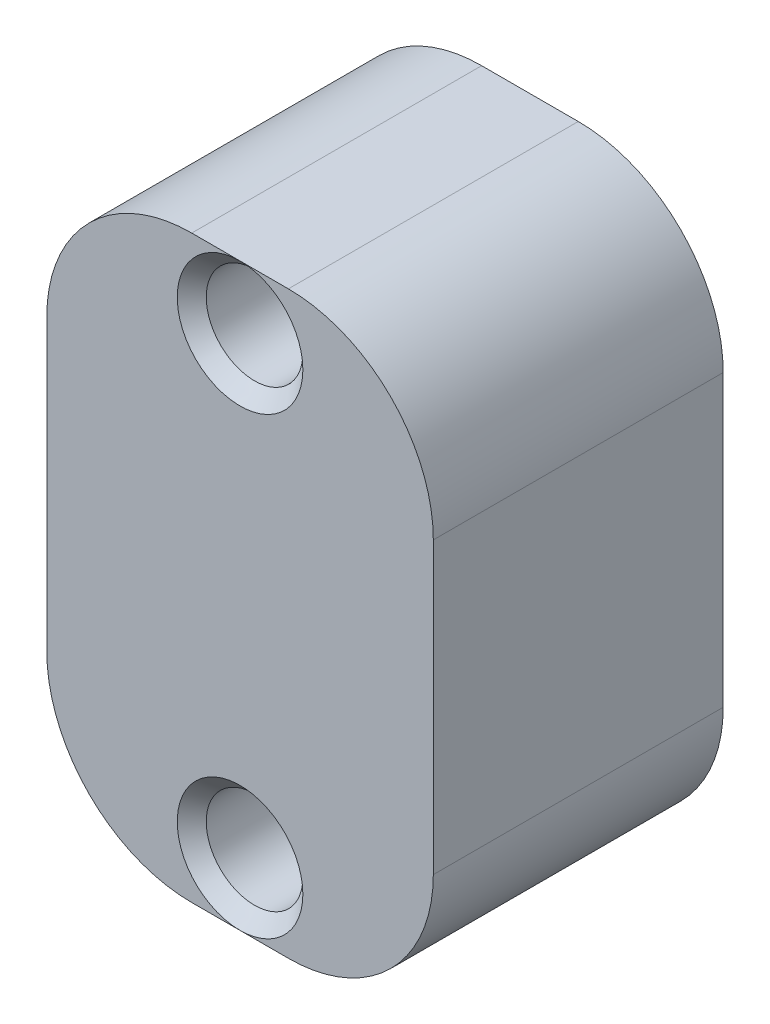
ISO-10303-21;
HEADER;
FILE_DESCRIPTION(('STEP AP214'),'2;1');
FILE_NAME('part.step','',(''),(''),'','','');
FILE_SCHEMA(('AUTOMOTIVE_DESIGN { 1 0 10303 214 1 1 1 1 }'));
ENDSEC;
DATA;
#1=APPLICATION_CONTEXT('core data for automotive mechanical design processes');
#2=APPLICATION_PROTOCOL_DEFINITION('international standard','automotive_design',2000,#1);
#3=PRODUCT_CONTEXT('',#1,'mechanical');
#4=PRODUCT('Part','Part','',(#3));
#5=PRODUCT_RELATED_PRODUCT_CATEGORY('part','',(#4));
#6=PRODUCT_DEFINITION_FORMATION('','',#4);
#7=PRODUCT_DEFINITION_CONTEXT('part definition',#1,'design');
#8=PRODUCT_DEFINITION('design','',#6,#7);
#9=PRODUCT_DEFINITION_SHAPE('','',#8);
#10=(LENGTH_UNIT() NAMED_UNIT(*) SI_UNIT(.MILLI.,.METRE.));
#11=(NAMED_UNIT(*) PLANE_ANGLE_UNIT() SI_UNIT($,.RADIAN.));
#12=(NAMED_UNIT(*) SI_UNIT($,.STERADIAN.) SOLID_ANGLE_UNIT());
#13=UNCERTAINTY_MEASURE_WITH_UNIT(LENGTH_MEASURE(1.E-05),#10,'distance_accuracy_value','');
#14=(GEOMETRIC_REPRESENTATION_CONTEXT(3) GLOBAL_UNCERTAINTY_ASSIGNED_CONTEXT((#13)) GLOBAL_UNIT_ASSIGNED_CONTEXT((#10,
#11,#12)) REPRESENTATION_CONTEXT('',''));
#15=CARTESIAN_POINT('',(0.,0.,0.));
#16=DIRECTION('',(0.,0.,1.));
#17=DIRECTION('',(1.,0.,0.));
#18=AXIS2_PLACEMENT_3D('',#15,#16,#17);
#19=CARTESIAN_POINT('',(14.,12.,-15.));
#20=DIRECTION('',(0.,1.,0.));
#21=DIRECTION('',(0.,0.,1.));
#22=AXIS2_PLACEMENT_3D('',#19,#20,#21);
#23=PLANE('',#22);
#24=DIRECTION('',(0.,0.,1.));
#25=VECTOR('',#24,1.);
#26=CARTESIAN_POINT('',(0.,12.,-15.));
#27=LINE('',#26,#25);
#28=CARTESIAN_POINT('',(0.,12.,-14.25));
#29=VERTEX_POINT('',#28);
#30=CARTESIAN_POINT('',(0.,12.,-6.));
#31=VERTEX_POINT('',#30);
#32=EDGE_CURVE('E203',#29,#31,#27,.T.);
#33=ORIENTED_EDGE('',*,*,#32,.T.);
#34=DIRECTION('',(-1.,0.,0.));
#35=VECTOR('',#34,1.);
#36=CARTESIAN_POINT('',(14.,12.,-6.));
#37=LINE('',#36,#35);
#38=CARTESIAN_POINT('',(14.,12.,-6.));
#39=VERTEX_POINT('',#38);
#40=EDGE_CURVE('E315',#31,#39,#37,.F.);
#41=ORIENTED_EDGE('',*,*,#40,.T.);
#42=DIRECTION('',(0.,0.,1.));
#43=VECTOR('',#42,1.);
#44=CARTESIAN_POINT('',(14.,12.,-15.));
#45=LINE('',#44,#43);
#46=CARTESIAN_POINT('',(14.,12.,-14.25));
#47=VERTEX_POINT('',#46);
#48=EDGE_CURVE('E229',#47,#39,#45,.T.);
#49=ORIENTED_EDGE('',*,*,#48,.F.);
#50=DIRECTION('',(-1.,0.,0.));
#51=VECTOR('',#50,1.);
#52=CARTESIAN_POINT('',(0.,12.,-14.25));
#53=LINE('',#52,#51);
#54=EDGE_CURVE('E264',#47,#29,#53,.T.);
#55=ORIENTED_EDGE('',*,*,#54,.T.);
#56=EDGE_LOOP('',(#33,#41,#49,#55));
#57=FACE_BOUND('',#56,.T.);
#58=ADVANCED_FACE('F52',(#57),#23,.T.);
#59=CARTESIAN_POINT('',(14.,15.,-15.));
#60=DIRECTION('',(0.,0.,1.));
#61=DIRECTION('',(1.,0.,0.));
#62=AXIS2_PLACEMENT_3D('',#59,#60,#61);
#63=CYLINDRICAL_SURFACE('',#62,3.00000000000001);
#64=ORIENTED_EDGE('',*,*,#48,.T.);
#65=CARTESIAN_POINT('',(14.,15.,-6.));
#66=DIRECTION('',(0.,0.,-1.));
#67=DIRECTION('',(-1.,0.,0.));
#68=AXIS2_PLACEMENT_3D('',#65,#66,#67);
#69=CIRCLE('',#68,3.00000000000001);
#70=CARTESIAN_POINT('',(14.,18.,-6.));
#71=VERTEX_POINT('',#70);
#72=EDGE_CURVE('E77',#39,#71,#69,.F.);
#73=ORIENTED_EDGE('',*,*,#72,.T.);
#74=DIRECTION('',(0.,0.,1.));
#75=VECTOR('',#74,1.);
#76=CARTESIAN_POINT('',(14.,18.,-15.));
#77=LINE('',#76,#75);
#78=CARTESIAN_POINT('',(14.,18.,-14.25));
#79=VERTEX_POINT('',#78);
#80=EDGE_CURVE('E231',#79,#71,#77,.T.);
#81=ORIENTED_EDGE('',*,*,#80,.F.);
#82=CARTESIAN_POINT('',(14.,15.,-14.25));
#83=DIRECTION('',(0.,0.,1.));
#84=DIRECTION('',(1.,0.,0.));
#85=AXIS2_PLACEMENT_3D('',#82,#83,#84);
#86=CIRCLE('',#85,3.00000000000001);
#87=EDGE_CURVE('E281',#79,#47,#86,.F.);
#88=ORIENTED_EDGE('',*,*,#87,.T.);
#89=EDGE_LOOP('',(#64,#73,#81,#88));
#90=FACE_BOUND('',#89,.T.);
#91=ADVANCED_FACE('F366',(#90),#63,.F.);
#92=CARTESIAN_POINT('',(14.,18.,-15.));
#93=DIRECTION('',(0.,-1.,0.));
#94=DIRECTION('',(0.,0.,-1.));
#95=AXIS2_PLACEMENT_3D('',#92,#93,#94);
#96=PLANE('',#95);
#97=ORIENTED_EDGE('',*,*,#80,.T.);
#98=DIRECTION('',(1.,0.,0.));
#99=VECTOR('',#98,1.);
#100=CARTESIAN_POINT('',(0.,18.,-6.));
#101=LINE('',#100,#99);
#102=CARTESIAN_POINT('',(0.,18.,-6.));
#103=VERTEX_POINT('',#102);
#104=EDGE_CURVE('E69',#71,#103,#101,.F.);
#105=ORIENTED_EDGE('',*,*,#104,.T.);
#106=DIRECTION('',(0.,0.,1.));
#107=VECTOR('',#106,1.);
#108=CARTESIAN_POINT('',(0.,18.,-15.));
#109=LINE('',#108,#107);
#110=CARTESIAN_POINT('',(0.,18.,-14.25));
#111=VERTEX_POINT('',#110);
#112=EDGE_CURVE('E233',#111,#103,#109,.T.);
#113=ORIENTED_EDGE('',*,*,#112,.F.);
#114=DIRECTION('',(1.,0.,0.));
#115=VECTOR('',#114,1.);
#116=CARTESIAN_POINT('',(14.,18.,-14.25));
#117=LINE('',#116,#115);
#118=EDGE_CURVE('E283',#111,#79,#117,.T.);
#119=ORIENTED_EDGE('',*,*,#118,.T.);
#120=EDGE_LOOP('',(#97,#105,#113,#119));
#121=FACE_BOUND('',#120,.T.);
#122=ADVANCED_FACE('F365',(#121),#96,.T.);
#123=CARTESIAN_POINT('',(0.,30.,-15.));
#124=DIRECTION('',(-1.,0.,0.));
#125=DIRECTION('',(0.,-1.,0.));
#126=AXIS2_PLACEMENT_3D('',#123,#124,#125);
#127=PLANE('',#126);
#128=DIRECTION('',(0.,-1.,0.));
#129=VECTOR('',#128,1.);
#130=CARTESIAN_POINT('',(0.,30.,-15.));
#131=LINE('',#130,#129);
#132=CARTESIAN_POINT('',(0.,22.5,-15.));
#133=VERTEX_POINT('',#132);
#134=CARTESIAN_POINT('',(0.,18.75,-15.));
#135=VERTEX_POINT('',#134);
#136=EDGE_CURVE('E217',#133,#135,#131,.T.);
#137=ORIENTED_EDGE('',*,*,#136,.T.);
#138=DIRECTION('',(0.,-0.707106781186551,0.707106781186544));
#139=VECTOR('',#138,1.);
#140=CARTESIAN_POINT('',(0.,24.3750000000001,-20.625));
#141=LINE('',#140,#139);
#142=EDGE_CURVE('E285',#135,#111,#141,.T.);
#143=ORIENTED_EDGE('',*,*,#142,.T.);
#144=ORIENTED_EDGE('',*,*,#112,.T.);
#145=CARTESIAN_POINT('',(0.,17.,-6.));
#146=DIRECTION('',(-1.,0.,0.));
#147=DIRECTION('',(0.,-1.,0.));
#148=AXIS2_PLACEMENT_3D('',#145,#146,#147);
#149=CIRCLE('',#148,1.);
#150=CARTESIAN_POINT('',(0.,17.,-5.));
#151=VERTEX_POINT('',#150);
#152=EDGE_CURVE('E14',#103,#151,#149,.F.);
#153=ORIENTED_EDGE('',*,*,#152,.T.);
#154=DIRECTION('',(0.,1.,0.));
#155=VECTOR('',#154,1.);
#156=CARTESIAN_POINT('',(0.,18.,-5.));
#157=LINE('',#156,#155);
#158=CARTESIAN_POINT('',(0.,13.,-5.));
#159=VERTEX_POINT('',#158);
#160=EDGE_CURVE('E307',#159,#151,#157,.T.);
#161=ORIENTED_EDGE('',*,*,#160,.F.);
#162=CARTESIAN_POINT('',(0.,13.,-6.));
#163=DIRECTION('',(-1.,0.,0.));
#164=DIRECTION('',(0.,-1.,0.));
#165=AXIS2_PLACEMENT_3D('',#162,#163,#164);
#166=CIRCLE('',#165,1.);
#167=EDGE_CURVE('E61',#159,#31,#166,.F.);
#168=ORIENTED_EDGE('',*,*,#167,.T.);
#169=ORIENTED_EDGE('',*,*,#32,.F.);
#170=DIRECTION('',(0.,-0.707106781186551,-0.707106781186544));
#171=VECTOR('',#170,1.);
#172=CARTESIAN_POINT('',(0.,11.625,-14.625));
#173=LINE('',#172,#171);
#174=CARTESIAN_POINT('',(0.,11.25,-15.));
#175=VERTEX_POINT('',#174);
#176=EDGE_CURVE('E267',#29,#175,#173,.T.);
#177=ORIENTED_EDGE('',*,*,#176,.T.);
#178=DIRECTION('',(0.,-1.,0.));
#179=VECTOR('',#178,1.);
#180=CARTESIAN_POINT('',(0.,12.,-15.));
#181=LINE('',#180,#179);
#182=CARTESIAN_POINT('',(0.,7.5,-15.));
#183=VERTEX_POINT('',#182);
#184=EDGE_CURVE('E200',#175,#183,#181,.T.);
#185=ORIENTED_EDGE('',*,*,#184,.T.);
#186=DIRECTION('',(0.,0.,1.));
#187=VECTOR('',#186,1.);
#188=CARTESIAN_POINT('',(0.,7.5,-15.));
#189=LINE('',#188,#187);
#190=CARTESIAN_POINT('',(0.,7.5,0.));
#191=VERTEX_POINT('',#190);
#192=EDGE_CURVE('E185',#183,#191,#189,.T.);
#193=ORIENTED_EDGE('',*,*,#192,.T.);
#194=DIRECTION('',(0.,-1.,0.));
#195=VECTOR('',#194,1.);
#196=CARTESIAN_POINT('',(0.,12.,0.));
#197=LINE('',#196,#195);
#198=CARTESIAN_POINT('',(0.,22.5,0.));
#199=VERTEX_POINT('',#198);
#200=EDGE_CURVE('E197',#199,#191,#197,.T.);
#201=ORIENTED_EDGE('',*,*,#200,.F.);
#202=DIRECTION('',(0.,0.,1.));
#203=VECTOR('',#202,1.);
#204=CARTESIAN_POINT('',(0.,22.5,-15.));
#205=LINE('',#204,#203);
#206=EDGE_CURVE('E262',#199,#133,#205,.F.);
#207=ORIENTED_EDGE('',*,*,#206,.T.);
#208=EDGE_LOOP('',(#137,#143,#144,#153,#161,#168,#169,#177,#185,#193,#201,#207));
#209=FACE_BOUND('',#208,.T.);
#210=ADVANCED_FACE('F196',(#209),#127,.T.);
#211=CARTESIAN_POINT('',(0.,30.,-15.));
#212=DIRECTION('',(0.,1.,0.));
#213=DIRECTION('',(-1.,0.,0.));
#214=AXIS2_PLACEMENT_3D('',#211,#212,#213);
#215=PLANE('',#214);
#216=DIRECTION('',(-1.,0.,0.));
#217=VECTOR('',#216,1.);
#218=CARTESIAN_POINT('',(0.,30.,0.));
#219=LINE('',#218,#217);
#220=CARTESIAN_POINT('',(12.5,30.,0.));
#221=VERTEX_POINT('',#220);
#222=CARTESIAN_POINT('',(10.,30.,0.));
#223=VERTEX_POINT('',#222);
#224=EDGE_CURVE('E224',#221,#223,#219,.T.);
#225=ORIENTED_EDGE('',*,*,#224,.F.);
#226=DIRECTION('',(0.,0.,1.));
#227=VECTOR('',#226,1.);
#228=CARTESIAN_POINT('',(12.5,30.,-15.));
#229=LINE('',#228,#227);
#230=CARTESIAN_POINT('',(12.5,30.,-15.));
#231=VERTEX_POINT('',#230);
#232=EDGE_CURVE('E260',#221,#231,#229,.F.);
#233=ORIENTED_EDGE('',*,*,#232,.T.);
#234=DIRECTION('',(-1.,0.,0.));
#235=VECTOR('',#234,1.);
#236=CARTESIAN_POINT('',(0.,30.,-15.));
#237=LINE('',#236,#235);
#238=CARTESIAN_POINT('',(10.,30.,-15.));
#239=VERTEX_POINT('',#238);
#240=EDGE_CURVE('E343',#231,#239,#237,.T.);
#241=ORIENTED_EDGE('',*,*,#240,.T.);
#242=CARTESIAN_POINT('',(7.49999999999999,30.,-15.));
#243=VERTEX_POINT('',#242);
#244=EDGE_CURVE('E342',#239,#243,#237,.T.);
#245=ORIENTED_EDGE('',*,*,#244,.T.);
#246=DIRECTION('',(0.,0.,1.));
#247=VECTOR('',#246,1.);
#248=CARTESIAN_POINT('',(7.49999999999999,30.,-15.));
#249=LINE('',#248,#247);
#250=CARTESIAN_POINT('',(7.49999999999999,30.,0.));
#251=VERTEX_POINT('',#250);
#252=EDGE_CURVE('E257',#243,#251,#249,.T.);
#253=ORIENTED_EDGE('',*,*,#252,.T.);
#254=EDGE_CURVE('E223',#223,#251,#219,.T.);
#255=ORIENTED_EDGE('',*,*,#254,.F.);
#256=EDGE_LOOP('',(#225,#233,#241,#245,#253,#255));
#257=FACE_BOUND('',#256,.T.);
#258=ADVANCED_FACE('F349',(#257),#215,.T.);
#259=CARTESIAN_POINT('',(20.,30.,-15.));
#260=DIRECTION('',(1.,0.,0.));
#261=DIRECTION('',(0.,0.,-1.));
#262=AXIS2_PLACEMENT_3D('',#259,#260,#261);
#263=PLANE('',#262);
#264=DIRECTION('',(0.,1.,0.));
#265=VECTOR('',#264,1.);
#266=CARTESIAN_POINT('',(20.,30.,0.));
#267=LINE('',#266,#265);
#268=CARTESIAN_POINT('',(20.,7.5,0.));
#269=VERTEX_POINT('',#268);
#270=CARTESIAN_POINT('',(20.,22.5,0.));
#271=VERTEX_POINT('',#270);
#272=EDGE_CURVE('E220',#269,#271,#267,.T.);
#273=ORIENTED_EDGE('',*,*,#272,.F.);
#274=DIRECTION('',(0.,0.,1.));
#275=VECTOR('',#274,1.);
#276=CARTESIAN_POINT('',(20.,7.5,-15.));
#277=LINE('',#276,#275);
#278=CARTESIAN_POINT('',(20.,7.5,-15.));
#279=VERTEX_POINT('',#278);
#280=EDGE_CURVE('E255',#269,#279,#277,.F.);
#281=ORIENTED_EDGE('',*,*,#280,.T.);
#282=DIRECTION('',(0.,1.,0.));
#283=VECTOR('',#282,1.);
#284=CARTESIAN_POINT('',(20.,30.,-15.));
#285=LINE('',#284,#283);
#286=CARTESIAN_POINT('',(20.,22.5,-15.));
#287=VERTEX_POINT('',#286);
#288=EDGE_CURVE('E340',#279,#287,#285,.T.);
#289=ORIENTED_EDGE('',*,*,#288,.T.);
#290=DIRECTION('',(0.,0.,1.));
#291=VECTOR('',#290,1.);
#292=CARTESIAN_POINT('',(20.,22.5,-15.));
#293=LINE('',#292,#291);
#294=EDGE_CURVE('E252',#287,#271,#293,.T.);
#295=ORIENTED_EDGE('',*,*,#294,.T.);
#296=EDGE_LOOP('',(#273,#281,#289,#295));
#297=FACE_BOUND('',#296,.T.);
#298=ADVANCED_FACE('F419',(#297),#263,.T.);
#299=CARTESIAN_POINT('',(20.,0.,-15.));
#300=DIRECTION('',(0.,-1.,0.));
#301=DIRECTION('',(1.,0.,0.));
#302=AXIS2_PLACEMENT_3D('',#299,#300,#301);
#303=PLANE('',#302);
#304=DIRECTION('',(1.,0.,0.));
#305=VECTOR('',#304,1.);
#306=CARTESIAN_POINT('',(20.,0.,0.));
#307=LINE('',#306,#305);
#308=CARTESIAN_POINT('',(7.5,0.,0.));
#309=VERTEX_POINT('',#308);
#310=CARTESIAN_POINT('',(10.,0.,0.));
#311=VERTEX_POINT('',#310);
#312=EDGE_CURVE('E211',#309,#311,#307,.T.);
#313=ORIENTED_EDGE('',*,*,#312,.F.);
#314=DIRECTION('',(0.,0.,1.));
#315=VECTOR('',#314,1.);
#316=CARTESIAN_POINT('',(7.5,0.,-15.));
#317=LINE('',#316,#315);
#318=CARTESIAN_POINT('',(7.5,0.,-15.));
#319=VERTEX_POINT('',#318);
#320=EDGE_CURVE('E186',#309,#319,#317,.F.);
#321=ORIENTED_EDGE('',*,*,#320,.T.);
#322=DIRECTION('',(1.,0.,0.));
#323=VECTOR('',#322,1.);
#324=CARTESIAN_POINT('',(20.,0.,-15.));
#325=LINE('',#324,#323);
#326=CARTESIAN_POINT('',(10.,0.,-15.));
#327=VERTEX_POINT('',#326);
#328=EDGE_CURVE('E337',#319,#327,#325,.T.);
#329=ORIENTED_EDGE('',*,*,#328,.T.);
#330=CARTESIAN_POINT('',(12.5,0.,-15.));
#331=VERTEX_POINT('',#330);
#332=EDGE_CURVE('E336',#327,#331,#325,.T.);
#333=ORIENTED_EDGE('',*,*,#332,.T.);
#334=DIRECTION('',(0.,0.,1.));
#335=VECTOR('',#334,1.);
#336=CARTESIAN_POINT('',(12.5,0.,-15.));
#337=LINE('',#336,#335);
#338=CARTESIAN_POINT('',(12.5,0.,0.));
#339=VERTEX_POINT('',#338);
#340=EDGE_CURVE('E191',#331,#339,#337,.T.);
#341=ORIENTED_EDGE('',*,*,#340,.T.);
#342=EDGE_CURVE('E208',#311,#339,#307,.T.);
#343=ORIENTED_EDGE('',*,*,#342,.F.);
#344=EDGE_LOOP('',(#313,#321,#329,#333,#341,#343));
#345=FACE_BOUND('',#344,.T.);
#346=ADVANCED_FACE('F381',(#345),#303,.T.);
#347=CARTESIAN_POINT('',(14.,15.,-15.));
#348=DIRECTION('',(0.,0.,1.));
#349=DIRECTION('',(1.,0.,0.));
#350=AXIS2_PLACEMENT_3D('',#347,#348,#349);
#351=PLANE('',#350);
#352=ORIENTED_EDGE('',*,*,#184,.F.);
#353=DIRECTION('',(1.,0.,0.));
#354=VECTOR('',#353,1.);
#355=CARTESIAN_POINT('',(14.,11.25,-15.));
#356=LINE('',#355,#354);
#357=CARTESIAN_POINT('',(14.,11.25,-15.));
#358=VERTEX_POINT('',#357);
#359=EDGE_CURVE('E279',#175,#358,#356,.T.);
#360=ORIENTED_EDGE('',*,*,#359,.T.);
#361=CARTESIAN_POINT('',(14.,15.,-15.));
#362=DIRECTION('',(0.,0.,1.));
#363=DIRECTION('',(1.,0.,0.));
#364=AXIS2_PLACEMENT_3D('',#361,#362,#363);
#365=CIRCLE('',#364,3.75000000000001);
#366=CARTESIAN_POINT('',(14.,18.75,-15.));
#367=VERTEX_POINT('',#366);
#368=EDGE_CURVE('E277',#358,#367,#365,.T.);
#369=ORIENTED_EDGE('',*,*,#368,.T.);
#370=DIRECTION('',(-1.,0.,0.));
#371=VECTOR('',#370,1.);
#372=CARTESIAN_POINT('',(0.,18.75,-15.));
#373=LINE('',#372,#371);
#374=EDGE_CURVE('E275',#367,#135,#373,.T.);
#375=ORIENTED_EDGE('',*,*,#374,.T.);
#376=ORIENTED_EDGE('',*,*,#136,.F.);
#377=CARTESIAN_POINT('',(7.5,22.5,-15.));
#378=DIRECTION('',(0.,0.,1.));
#379=DIRECTION('',(1.,0.,0.));
#380=AXIS2_PLACEMENT_3D('',#377,#378,#379);
#381=CIRCLE('',#380,7.5);
#382=EDGE_CURVE('E242',#133,#243,#381,.F.);
#383=ORIENTED_EDGE('',*,*,#382,.T.);
#384=ORIENTED_EDGE('',*,*,#244,.F.);
#385=CARTESIAN_POINT('',(10.,26.75,-15.));
#386=DIRECTION('',(0.,0.,1.));
#387=DIRECTION('',(1.,0.,0.));
#388=AXIS2_PLACEMENT_3D('',#385,#386,#387);
#389=CIRCLE('',#388,3.24999999999999);
#390=EDGE_CURVE('E272',#239,#239,#389,.T.);
#391=ORIENTED_EDGE('',*,*,#390,.T.);
#392=ORIENTED_EDGE('',*,*,#240,.F.);
#393=CARTESIAN_POINT('',(12.5,22.5,-15.));
#394=DIRECTION('',(0.,0.,1.));
#395=DIRECTION('',(1.,0.,0.));
#396=AXIS2_PLACEMENT_3D('',#393,#394,#395);
#397=CIRCLE('',#396,7.5);
#398=EDGE_CURVE('E245',#231,#287,#397,.F.);
#399=ORIENTED_EDGE('',*,*,#398,.T.);
#400=ORIENTED_EDGE('',*,*,#288,.F.);
#401=CARTESIAN_POINT('',(12.5,7.5,-15.));
#402=DIRECTION('',(0.,0.,1.));
#403=DIRECTION('',(1.,0.,0.));
#404=AXIS2_PLACEMENT_3D('',#401,#402,#403);
#405=CIRCLE('',#404,7.5);
#406=EDGE_CURVE('E247',#279,#331,#405,.F.);
#407=ORIENTED_EDGE('',*,*,#406,.T.);
#408=ORIENTED_EDGE('',*,*,#332,.F.);
#409=CARTESIAN_POINT('',(10.,3.25,-15.));
#410=DIRECTION('',(0.,0.,1.));
#411=DIRECTION('',(1.,0.,0.));
#412=AXIS2_PLACEMENT_3D('',#409,#410,#411);
#413=CIRCLE('',#412,3.25);
#414=EDGE_CURVE('E269',#327,#327,#413,.T.);
#415=ORIENTED_EDGE('',*,*,#414,.T.);
#416=ORIENTED_EDGE('',*,*,#328,.F.);
#417=CARTESIAN_POINT('',(7.5,7.5,-15.));
#418=DIRECTION('',(0.,0.,1.));
#419=DIRECTION('',(1.,0.,0.));
#420=AXIS2_PLACEMENT_3D('',#417,#418,#419);
#421=CIRCLE('',#420,7.5);
#422=EDGE_CURVE('E250',#319,#183,#421,.F.);
#423=ORIENTED_EDGE('',*,*,#422,.T.);
#424=EDGE_LOOP('',(#352,#360,#369,#375,#376,#383,#384,#391,#392,#399,#400,#407,#408,#415,#416,#423));
#425=FACE_BOUND('',#424,.T.);
#426=ADVANCED_FACE('F355',(#425),#351,.F.);
#427=CARTESIAN_POINT('',(14.,15.,0.));
#428=DIRECTION('',(0.,0.,1.));
#429=DIRECTION('',(1.,0.,0.));
#430=AXIS2_PLACEMENT_3D('',#427,#428,#429);
#431=PLANE('',#430);
#432=ORIENTED_EDGE('',*,*,#312,.T.);
#433=CARTESIAN_POINT('',(10.,3.25,0.));
#434=DIRECTION('',(0.,0.,1.));
#435=DIRECTION('',(1.,0.,0.));
#436=AXIS2_PLACEMENT_3D('',#433,#434,#435);
#437=CIRCLE('',#436,3.25);
#438=EDGE_CURVE('E302',#311,#311,#437,.F.);
#439=ORIENTED_EDGE('',*,*,#438,.T.);
#440=ORIENTED_EDGE('',*,*,#342,.T.);
#441=CARTESIAN_POINT('',(12.5,7.5,0.));
#442=DIRECTION('',(0.,0.,1.));
#443=DIRECTION('',(1.,0.,0.));
#444=AXIS2_PLACEMENT_3D('',#441,#442,#443);
#445=CIRCLE('',#444,7.5);
#446=EDGE_CURVE('E192',#339,#269,#445,.T.);
#447=ORIENTED_EDGE('',*,*,#446,.T.);
#448=ORIENTED_EDGE('',*,*,#272,.T.);
#449=CARTESIAN_POINT('',(12.5,22.5,0.));
#450=DIRECTION('',(0.,0.,1.));
#451=DIRECTION('',(1.,0.,0.));
#452=AXIS2_PLACEMENT_3D('',#449,#450,#451);
#453=CIRCLE('',#452,7.5);
#454=EDGE_CURVE('E236',#271,#221,#453,.T.);
#455=ORIENTED_EDGE('',*,*,#454,.T.);
#456=ORIENTED_EDGE('',*,*,#224,.T.);
#457=CARTESIAN_POINT('',(10.,26.75,0.));
#458=DIRECTION('',(0.,0.,1.));
#459=DIRECTION('',(1.,0.,0.));
#460=AXIS2_PLACEMENT_3D('',#457,#458,#459);
#461=CIRCLE('',#460,3.25);
#462=EDGE_CURVE('E299',#223,#223,#461,.F.);
#463=ORIENTED_EDGE('',*,*,#462,.T.);
#464=ORIENTED_EDGE('',*,*,#254,.T.);
#465=CARTESIAN_POINT('',(7.5,22.5,0.));
#466=DIRECTION('',(0.,0.,1.));
#467=DIRECTION('',(1.,0.,0.));
#468=AXIS2_PLACEMENT_3D('',#465,#466,#467);
#469=CIRCLE('',#468,7.5);
#470=EDGE_CURVE('E202',#251,#199,#469,.T.);
#471=ORIENTED_EDGE('',*,*,#470,.T.);
#472=ORIENTED_EDGE('',*,*,#200,.T.);
#473=CARTESIAN_POINT('',(7.5,7.5,0.));
#474=DIRECTION('',(0.,0.,1.));
#475=DIRECTION('',(1.,0.,0.));
#476=AXIS2_PLACEMENT_3D('',#473,#474,#475);
#477=CIRCLE('',#476,7.5);
#478=EDGE_CURVE('E181',#191,#309,#477,.T.);
#479=ORIENTED_EDGE('',*,*,#478,.T.);
#480=EDGE_LOOP('',(#432,#439,#440,#447,#448,#455,#456,#463,#464,#471,#472,#479));
#481=FACE_BOUND('',#480,.T.);
#482=ADVANCED_FACE('F205',(#481),#431,.T.);
#483=CARTESIAN_POINT('',(10.,3.25,-15.));
#484=DIRECTION('',(0.,0.,1.));
#485=DIRECTION('',(1.,0.,0.));
#486=AXIS2_PLACEMENT_3D('',#483,#484,#485);
#487=CYLINDRICAL_SURFACE('',#486,2.5);
#488=CARTESIAN_POINT('',(10.,3.25,-14.25));
#489=DIRECTION('',(0.,0.,1.));
#490=DIRECTION('',(1.,0.,0.));
#491=AXIS2_PLACEMENT_3D('',#488,#489,#490);
#492=CIRCLE('',#491,2.5);
#493=CARTESIAN_POINT('',(12.5,3.25,-14.25));
#494=VERTEX_POINT('',#493);
#495=EDGE_CURVE('E296',#494,#494,#492,.F.);
#496=ORIENTED_EDGE('',*,*,#495,.T.);
#497=EDGE_LOOP('',(#496));
#498=FACE_BOUND('',#497,.T.);
#499=CARTESIAN_POINT('',(10.,3.25,-0.750000000000001));
#500=DIRECTION('',(0.,0.,1.));
#501=DIRECTION('',(1.,0.,0.));
#502=AXIS2_PLACEMENT_3D('',#499,#500,#501);
#503=CIRCLE('',#502,2.5);
#504=CARTESIAN_POINT('',(12.5,3.25,-0.750000000000001));
#505=VERTEX_POINT('',#504);
#506=EDGE_CURVE('E293',#505,#505,#503,.T.);
#507=ORIENTED_EDGE('',*,*,#506,.T.);
#508=EDGE_LOOP('',(#507));
#509=FACE_BOUND('',#508,.T.);
#510=ADVANCED_FACE('F393',(#498,#509),#487,.F.);
#511=CARTESIAN_POINT('',(10.,26.75,-15.));
#512=DIRECTION('',(0.,0.,1.));
#513=DIRECTION('',(1.,0.,0.));
#514=AXIS2_PLACEMENT_3D('',#511,#512,#513);
#515=CYLINDRICAL_SURFACE('',#514,2.5);
#516=CARTESIAN_POINT('',(10.,26.75,-14.25));
#517=DIRECTION('',(0.,0.,1.));
#518=DIRECTION('',(1.,0.,0.));
#519=AXIS2_PLACEMENT_3D('',#516,#517,#518);
#520=CIRCLE('',#519,2.5);
#521=CARTESIAN_POINT('',(12.5,26.75,-14.25));
#522=VERTEX_POINT('',#521);
#523=EDGE_CURVE('E290',#522,#522,#520,.F.);
#524=ORIENTED_EDGE('',*,*,#523,.T.);
#525=EDGE_LOOP('',(#524));
#526=FACE_BOUND('',#525,.T.);
#527=CARTESIAN_POINT('',(10.,26.75,-0.750000000000001));
#528=DIRECTION('',(0.,0.,1.));
#529=DIRECTION('',(1.,0.,0.));
#530=AXIS2_PLACEMENT_3D('',#527,#528,#529);
#531=CIRCLE('',#530,2.5);
#532=CARTESIAN_POINT('',(12.5,26.75,-0.750000000000001));
#533=VERTEX_POINT('',#532);
#534=EDGE_CURVE('E287',#533,#533,#531,.T.);
#535=ORIENTED_EDGE('',*,*,#534,.T.);
#536=EDGE_LOOP('',(#535));
#537=FACE_BOUND('',#536,.T.);
#538=ADVANCED_FACE('F395',(#526,#537),#515,.F.);
#539=CARTESIAN_POINT('',(7.5,7.5,-15.));
#540=DIRECTION('',(0.,0.,1.));
#541=DIRECTION('',(1.,0.,0.));
#542=AXIS2_PLACEMENT_3D('',#539,#540,#541);
#543=CYLINDRICAL_SURFACE('',#542,7.5);
#544=ORIENTED_EDGE('',*,*,#422,.F.);
#545=ORIENTED_EDGE('',*,*,#320,.F.);
#546=ORIENTED_EDGE('',*,*,#478,.F.);
#547=ORIENTED_EDGE('',*,*,#192,.F.);
#548=EDGE_LOOP('',(#544,#545,#546,#547));
#549=FACE_BOUND('',#548,.T.);
#550=ADVANCED_FACE('F184',(#549),#543,.T.);
#551=CARTESIAN_POINT('',(12.5,7.5,-15.));
#552=DIRECTION('',(0.,0.,1.));
#553=DIRECTION('',(1.,0.,0.));
#554=AXIS2_PLACEMENT_3D('',#551,#552,#553);
#555=CYLINDRICAL_SURFACE('',#554,7.5);
#556=ORIENTED_EDGE('',*,*,#406,.F.);
#557=ORIENTED_EDGE('',*,*,#280,.F.);
#558=ORIENTED_EDGE('',*,*,#446,.F.);
#559=ORIENTED_EDGE('',*,*,#340,.F.);
#560=EDGE_LOOP('',(#556,#557,#558,#559));
#561=FACE_BOUND('',#560,.T.);
#562=ADVANCED_FACE('F427',(#561),#555,.T.);
#563=CARTESIAN_POINT('',(12.5,22.5,-15.));
#564=DIRECTION('',(0.,0.,1.));
#565=DIRECTION('',(1.,0.,0.));
#566=AXIS2_PLACEMENT_3D('',#563,#564,#565);
#567=CYLINDRICAL_SURFACE('',#566,7.5);
#568=ORIENTED_EDGE('',*,*,#398,.F.);
#569=ORIENTED_EDGE('',*,*,#232,.F.);
#570=ORIENTED_EDGE('',*,*,#454,.F.);
#571=ORIENTED_EDGE('',*,*,#294,.F.);
#572=EDGE_LOOP('',(#568,#569,#570,#571));
#573=FACE_BOUND('',#572,.T.);
#574=ADVANCED_FACE('F430',(#573),#567,.T.);
#575=CARTESIAN_POINT('',(7.5,22.5,-15.));
#576=DIRECTION('',(0.,0.,1.));
#577=DIRECTION('',(1.,0.,0.));
#578=AXIS2_PLACEMENT_3D('',#575,#576,#577);
#579=CYLINDRICAL_SURFACE('',#578,7.5);
#580=ORIENTED_EDGE('',*,*,#382,.F.);
#581=ORIENTED_EDGE('',*,*,#206,.F.);
#582=ORIENTED_EDGE('',*,*,#470,.F.);
#583=ORIENTED_EDGE('',*,*,#252,.F.);
#584=EDGE_LOOP('',(#580,#581,#582,#583));
#585=FACE_BOUND('',#584,.T.);
#586=ADVANCED_FACE('F357',(#585),#579,.T.);
#587=CARTESIAN_POINT('',(14.,18.,-14.25));
#588=DIRECTION('',(0.,-0.707106781186544,-0.707106781186551));
#589=DIRECTION('',(-1.,0.,0.));
#590=AXIS2_PLACEMENT_3D('',#587,#588,#589);
#591=PLANE('',#590);
#592=ORIENTED_EDGE('',*,*,#142,.F.);
#593=ORIENTED_EDGE('',*,*,#374,.F.);
#594=DIRECTION('',(0.,0.707106781186551,-0.707106781186544));
#595=VECTOR('',#594,1.);
#596=CARTESIAN_POINT('',(14.,18.,-14.25));
#597=LINE('',#596,#595);
#598=EDGE_CURVE('E209',#79,#367,#597,.T.);
#599=ORIENTED_EDGE('',*,*,#598,.F.);
#600=ORIENTED_EDGE('',*,*,#118,.F.);
#601=EDGE_LOOP('',(#592,#593,#599,#600));
#602=FACE_BOUND('',#601,.T.);
#603=ADVANCED_FACE('F362',(#602),#591,.T.);
#604=CARTESIAN_POINT('',(14.,15.,-14.25));
#605=DIRECTION('',(0.,0.,-1.));
#606=DIRECTION('',(-1.,0.,0.));
#607=AXIS2_PLACEMENT_3D('',#604,#605,#606);
#608=CONICAL_SURFACE('',#607,3.00000000000001,0.785398163397453);
#609=ORIENTED_EDGE('',*,*,#598,.T.);
#610=ORIENTED_EDGE('',*,*,#368,.F.);
#611=DIRECTION('',(0.,-0.707106781186552,-0.707106781186543));
#612=VECTOR('',#611,1.);
#613=CARTESIAN_POINT('',(14.,12.,-14.25));
#614=LINE('',#613,#612);
#615=EDGE_CURVE('E214',#47,#358,#614,.T.);
#616=ORIENTED_EDGE('',*,*,#615,.F.);
#617=ORIENTED_EDGE('',*,*,#87,.F.);
#618=EDGE_LOOP('',(#609,#610,#616,#617));
#619=FACE_BOUND('',#618,.T.);
#620=ADVANCED_FACE('F374',(#619),#608,.F.);
#621=CARTESIAN_POINT('',(14.,12.,-14.25));
#622=DIRECTION('',(0.,0.707106781186544,-0.707106781186551));
#623=DIRECTION('',(1.,0.,0.));
#624=AXIS2_PLACEMENT_3D('',#621,#622,#623);
#625=PLANE('',#624);
#626=ORIENTED_EDGE('',*,*,#615,.T.);
#627=ORIENTED_EDGE('',*,*,#359,.F.);
#628=ORIENTED_EDGE('',*,*,#176,.F.);
#629=ORIENTED_EDGE('',*,*,#54,.F.);
#630=EDGE_LOOP('',(#626,#627,#628,#629));
#631=FACE_BOUND('',#630,.T.);
#632=ADVANCED_FACE('F377',(#631),#625,.T.);
#633=CARTESIAN_POINT('',(10.,26.75,-15.));
#634=DIRECTION('',(0.,0.,-1.));
#635=DIRECTION('',(-1.,0.,0.));
#636=AXIS2_PLACEMENT_3D('',#633,#634,#635);
#637=CONICAL_SURFACE('',#636,3.24999999999999,0.785398163397445);
#638=ORIENTED_EDGE('',*,*,#523,.F.);
#639=EDGE_LOOP('',(#638));
#640=FACE_BOUND('',#639,.T.);
#641=ORIENTED_EDGE('',*,*,#390,.F.);
#642=EDGE_LOOP('',(#641));
#643=FACE_BOUND('',#642,.T.);
#644=ADVANCED_FACE('F439',(#640,#643),#637,.F.);
#645=CARTESIAN_POINT('',(10.,3.25,-15.));
#646=DIRECTION('',(0.,0.,-1.));
#647=DIRECTION('',(-1.,0.,0.));
#648=AXIS2_PLACEMENT_3D('',#645,#646,#647);
#649=CONICAL_SURFACE('',#648,3.25,0.785398163397441);
#650=ORIENTED_EDGE('',*,*,#495,.F.);
#651=EDGE_LOOP('',(#650));
#652=FACE_BOUND('',#651,.T.);
#653=ORIENTED_EDGE('',*,*,#414,.F.);
#654=EDGE_LOOP('',(#653));
#655=FACE_BOUND('',#654,.T.);
#656=ADVANCED_FACE('F389',(#652,#655),#649,.F.);
#657=CARTESIAN_POINT('',(10.,3.25,-0.750000000000001));
#658=DIRECTION('',(0.,0.,1.));
#659=DIRECTION('',(1.,0.,0.));
#660=AXIS2_PLACEMENT_3D('',#657,#658,#659);
#661=CONICAL_SURFACE('',#660,2.5,0.785398163397449);
#662=ORIENTED_EDGE('',*,*,#438,.F.);
#663=EDGE_LOOP('',(#662));
#664=FACE_BOUND('',#663,.T.);
#665=ORIENTED_EDGE('',*,*,#506,.F.);
#666=EDGE_LOOP('',(#665));
#667=FACE_BOUND('',#666,.T.);
#668=ADVANCED_FACE('F385',(#664,#667),#661,.F.);
#669=CARTESIAN_POINT('',(10.,26.75,-0.750000000000001));
#670=DIRECTION('',(0.,0.,1.));
#671=DIRECTION('',(1.,0.,0.));
#672=AXIS2_PLACEMENT_3D('',#669,#670,#671);
#673=CONICAL_SURFACE('',#672,2.5,0.78539816339745);
#674=ORIENTED_EDGE('',*,*,#462,.F.);
#675=EDGE_LOOP('',(#674));
#676=FACE_BOUND('',#675,.T.);
#677=ORIENTED_EDGE('',*,*,#534,.F.);
#678=EDGE_LOOP('',(#677));
#679=FACE_BOUND('',#678,.T.);
#680=ADVANCED_FACE('F388',(#676,#679),#673,.F.);
#681=CARTESIAN_POINT('',(14.,15.,-5.));
#682=DIRECTION('',(0.,0.,-1.));
#683=DIRECTION('',(-1.,0.,0.));
#684=AXIS2_PLACEMENT_3D('',#681,#682,#683);
#685=PLANE('',#684);
#686=CARTESIAN_POINT('',(14.,15.,-5.));
#687=DIRECTION('',(0.,0.,-1.));
#688=DIRECTION('',(-1.,0.,0.));
#689=AXIS2_PLACEMENT_3D('',#686,#687,#688);
#690=CIRCLE('',#689,2.00000000000001);
#691=CARTESIAN_POINT('',(14.,17.,-5.));
#692=VERTEX_POINT('',#691);
#693=CARTESIAN_POINT('',(14.,13.,-5.));
#694=VERTEX_POINT('',#693);
#695=EDGE_CURVE('E310',#692,#694,#690,.T.);
#696=ORIENTED_EDGE('',*,*,#695,.T.);
#697=DIRECTION('',(-1.,0.,0.));
#698=VECTOR('',#697,1.);
#699=CARTESIAN_POINT('',(0.,13.,-5.));
#700=LINE('',#699,#698);
#701=EDGE_CURVE('E312',#694,#159,#700,.T.);
#702=ORIENTED_EDGE('',*,*,#701,.T.);
#703=ORIENTED_EDGE('',*,*,#160,.T.);
#704=DIRECTION('',(1.,0.,0.));
#705=VECTOR('',#704,1.);
#706=CARTESIAN_POINT('',(14.,17.,-5.));
#707=LINE('',#706,#705);
#708=EDGE_CURVE('E305',#151,#692,#707,.T.);
#709=ORIENTED_EDGE('',*,*,#708,.T.);
#710=EDGE_LOOP('',(#696,#702,#703,#709));
#711=FACE_BOUND('',#710,.T.);
#712=ADVANCED_FACE('F452',(#711),#685,.T.);
#713=CARTESIAN_POINT('',(14.,17.,-6.));
#714=DIRECTION('',(-1.,0.,0.));
#715=DIRECTION('',(0.,0.,1.));
#716=AXIS2_PLACEMENT_3D('',#713,#714,#715);
#717=CYLINDRICAL_SURFACE('',#716,1.);
#718=ORIENTED_EDGE('',*,*,#152,.F.);
#719=ORIENTED_EDGE('',*,*,#104,.F.);
#720=CARTESIAN_POINT('',(14.,17.,-6.));
#721=DIRECTION('',(-1.,0.,0.));
#722=DIRECTION('',(0.,0.,1.));
#723=AXIS2_PLACEMENT_3D('',#720,#721,#722);
#724=CIRCLE('',#723,1.);
#725=EDGE_CURVE('E56',#692,#71,#724,.T.);
#726=ORIENTED_EDGE('',*,*,#725,.F.);
#727=ORIENTED_EDGE('',*,*,#708,.F.);
#728=EDGE_LOOP('',(#718,#719,#726,#727));
#729=FACE_BOUND('',#728,.T.);
#730=ADVANCED_FACE('F54',(#729),#717,.F.);
#731=CARTESIAN_POINT('',(14.,15.,-6.));
#732=DIRECTION('',(0.,0.,-1.));
#733=DIRECTION('',(-1.,0.,0.));
#734=AXIS2_PLACEMENT_3D('',#731,#732,#733);
#735=TOROIDAL_SURFACE('',#734,2.00000000000001,1.);
#736=ORIENTED_EDGE('',*,*,#725,.T.);
#737=ORIENTED_EDGE('',*,*,#72,.F.);
#738=CARTESIAN_POINT('',(14.,13.,-6.));
#739=DIRECTION('',(1.,0.,0.));
#740=DIRECTION('',(0.,0.,-1.));
#741=AXIS2_PLACEMENT_3D('',#738,#739,#740);
#742=CIRCLE('',#741,1.);
#743=EDGE_CURVE('E319',#694,#39,#742,.T.);
#744=ORIENTED_EDGE('',*,*,#743,.F.);
#745=ORIENTED_EDGE('',*,*,#695,.F.);
#746=EDGE_LOOP('',(#736,#737,#744,#745));
#747=FACE_BOUND('',#746,.T.);
#748=ADVANCED_FACE('F456',(#747),#735,.F.);
#749=CARTESIAN_POINT('',(14.,13.,-6.));
#750=DIRECTION('',(1.,0.,0.));
#751=DIRECTION('',(0.,0.,-1.));
#752=AXIS2_PLACEMENT_3D('',#749,#750,#751);
#753=CYLINDRICAL_SURFACE('',#752,1.);
#754=ORIENTED_EDGE('',*,*,#743,.T.);
#755=ORIENTED_EDGE('',*,*,#40,.F.);
#756=ORIENTED_EDGE('',*,*,#167,.F.);
#757=ORIENTED_EDGE('',*,*,#701,.F.);
#758=EDGE_LOOP('',(#754,#755,#756,#757));
#759=FACE_BOUND('',#758,.T.);
#760=ADVANCED_FACE('F454',(#759),#753,.F.);
#761=CLOSED_SHELL('',(#58,#91,#122,#210,#258,#298,#346,#426,#482,#510,#538,#550,#562,#574,#586,
#603,#620,#632,#644,#656,#668,#680,#712,#730,#748,#760));
#762=MANIFOLD_SOLID_BREP('B2',#761);
#763=ADVANCED_BREP_SHAPE_REPRESENTATION('',(#18,#762),#14);
#764=SHAPE_DEFINITION_REPRESENTATION(#9,#763);
ENDSEC;
END-ISO-10303-21;
